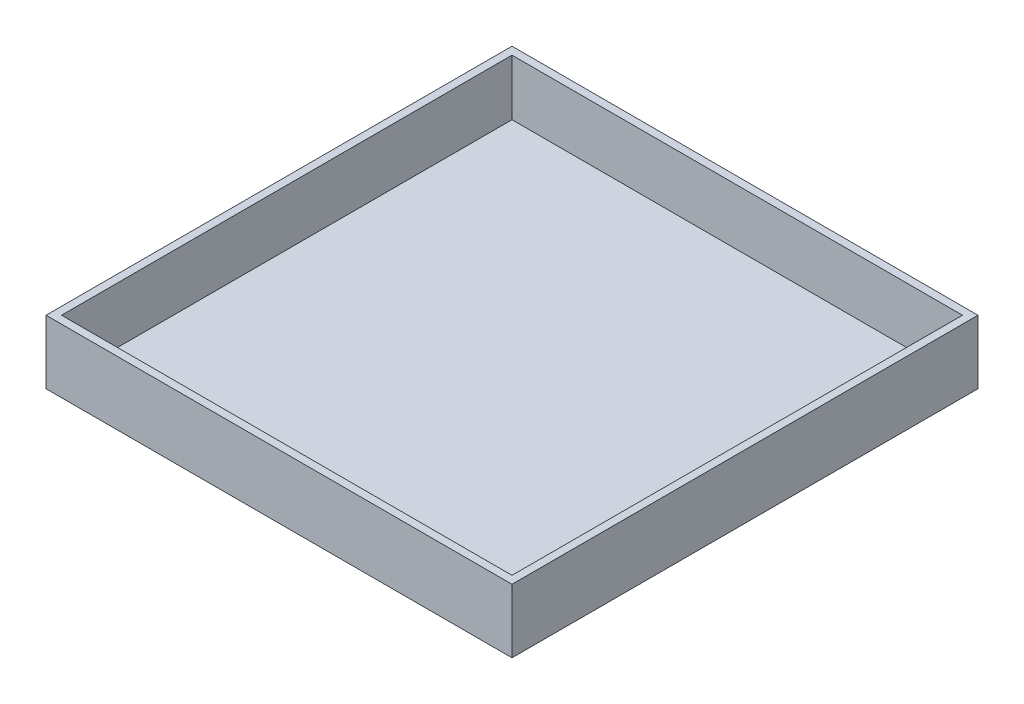
ISO-10303-21;
HEADER;
FILE_DESCRIPTION(('STEP AP214'),'2;1');
FILE_NAME('part.step','',(''),(''),'','','');
FILE_SCHEMA(('AUTOMOTIVE_DESIGN { 1 0 10303 214 1 1 1 1 }'));
ENDSEC;
DATA;
#1=APPLICATION_CONTEXT('core data for automotive mechanical design processes');
#2=APPLICATION_PROTOCOL_DEFINITION('international standard','automotive_design',2000,#1);
#3=PRODUCT_CONTEXT('',#1,'mechanical');
#4=PRODUCT('Part','Part','',(#3));
#5=PRODUCT_RELATED_PRODUCT_CATEGORY('part','',(#4));
#6=PRODUCT_DEFINITION_FORMATION('','',#4);
#7=PRODUCT_DEFINITION_CONTEXT('part definition',#1,'design');
#8=PRODUCT_DEFINITION('design','',#6,#7);
#9=PRODUCT_DEFINITION_SHAPE('','',#8);
#10=(LENGTH_UNIT() NAMED_UNIT(*) SI_UNIT(.MILLI.,.METRE.));
#11=(NAMED_UNIT(*) PLANE_ANGLE_UNIT() SI_UNIT($,.RADIAN.));
#12=(NAMED_UNIT(*) SI_UNIT($,.STERADIAN.) SOLID_ANGLE_UNIT());
#13=UNCERTAINTY_MEASURE_WITH_UNIT(LENGTH_MEASURE(1.E-05),#10,'distance_accuracy_value','');
#14=(GEOMETRIC_REPRESENTATION_CONTEXT(3) GLOBAL_UNCERTAINTY_ASSIGNED_CONTEXT((#13)) GLOBAL_UNIT_ASSIGNED_CONTEXT((#10,
#11,#12)) REPRESENTATION_CONTEXT('',''));
#15=CARTESIAN_POINT('',(0.,0.,0.));
#16=DIRECTION('',(0.,0.,1.));
#17=DIRECTION('',(1.,0.,0.));
#18=AXIS2_PLACEMENT_3D('',#15,#16,#17);
#19=CARTESIAN_POINT('',(-150.,5.,-150.));
#20=DIRECTION('',(1.,0.,0.));
#21=DIRECTION('',(0.,0.,-1.));
#22=AXIS2_PLACEMENT_3D('',#19,#20,#21);
#23=PLANE('',#22);
#24=DIRECTION('',(0.,0.,1.));
#25=VECTOR('',#24,1.);
#26=CARTESIAN_POINT('',(-150.,0.,-150.));
#27=LINE('',#26,#25);
#28=CARTESIAN_POINT('',(-150.,0.,-150.));
#29=VERTEX_POINT('',#28);
#30=CARTESIAN_POINT('',(-150.,0.,150.));
#31=VERTEX_POINT('',#30);
#32=EDGE_CURVE('E167',#29,#31,#27,.T.);
#33=ORIENTED_EDGE('',*,*,#32,.T.);
#34=DIRECTION('',(0.,-1.,0.));
#35=VECTOR('',#34,1.);
#36=CARTESIAN_POINT('',(-150.,5.,150.));
#37=LINE('',#36,#35);
#38=CARTESIAN_POINT('',(-150.,41.,150.));
#39=VERTEX_POINT('',#38);
#40=EDGE_CURVE('E11',#39,#31,#37,.T.);
#41=ORIENTED_EDGE('',*,*,#40,.F.);
#42=DIRECTION('',(0.,0.,1.));
#43=VECTOR('',#42,1.);
#44=CARTESIAN_POINT('',(-150.,41.,-150.));
#45=LINE('',#44,#43);
#46=CARTESIAN_POINT('',(-150.,41.,-150.));
#47=VERTEX_POINT('',#46);
#48=EDGE_CURVE('E120',#47,#39,#45,.T.);
#49=ORIENTED_EDGE('',*,*,#48,.F.);
#50=DIRECTION('',(0.,-1.,0.));
#51=VECTOR('',#50,1.);
#52=CARTESIAN_POINT('',(-150.,5.,-150.));
#53=LINE('',#52,#51);
#54=EDGE_CURVE('E180',#47,#29,#53,.T.);
#55=ORIENTED_EDGE('',*,*,#54,.T.);
#56=EDGE_LOOP('',(#33,#41,#49,#55));
#57=FACE_BOUND('',#56,.T.);
#58=ADVANCED_FACE('F39',(#57),#23,.F.);
#59=CARTESIAN_POINT('',(-150.,5.,150.));
#60=DIRECTION('',(0.,0.,-1.));
#61=DIRECTION('',(-1.,0.,0.));
#62=AXIS2_PLACEMENT_3D('',#59,#60,#61);
#63=PLANE('',#62);
#64=DIRECTION('',(1.,0.,0.));
#65=VECTOR('',#64,1.);
#66=CARTESIAN_POINT('',(-150.,0.,150.));
#67=LINE('',#66,#65);
#68=CARTESIAN_POINT('',(150.,0.,150.));
#69=VERTEX_POINT('',#68);
#70=EDGE_CURVE('E171',#31,#69,#67,.T.);
#71=ORIENTED_EDGE('',*,*,#70,.T.);
#72=DIRECTION('',(0.,-1.,0.));
#73=VECTOR('',#72,1.);
#74=CARTESIAN_POINT('',(150.,5.,150.));
#75=LINE('',#74,#73);
#76=CARTESIAN_POINT('',(150.,41.,150.));
#77=VERTEX_POINT('',#76);
#78=EDGE_CURVE('E47',#77,#69,#75,.T.);
#79=ORIENTED_EDGE('',*,*,#78,.F.);
#80=DIRECTION('',(1.,0.,0.));
#81=VECTOR('',#80,1.);
#82=CARTESIAN_POINT('',(-150.,41.,150.));
#83=LINE('',#82,#81);
#84=EDGE_CURVE('E155',#39,#77,#83,.T.);
#85=ORIENTED_EDGE('',*,*,#84,.F.);
#86=ORIENTED_EDGE('',*,*,#40,.T.);
#87=EDGE_LOOP('',(#71,#79,#85,#86));
#88=FACE_BOUND('',#87,.T.);
#89=ADVANCED_FACE('F205',(#88),#63,.F.);
#90=CARTESIAN_POINT('',(150.,5.,-150.));
#91=DIRECTION('',(-1.,0.,0.));
#92=DIRECTION('',(0.,0.,1.));
#93=AXIS2_PLACEMENT_3D('',#90,#91,#92);
#94=PLANE('',#93);
#95=DIRECTION('',(0.,0.,-1.));
#96=VECTOR('',#95,1.);
#97=CARTESIAN_POINT('',(150.,0.,-150.));
#98=LINE('',#97,#96);
#99=CARTESIAN_POINT('',(150.,0.,-150.));
#100=VERTEX_POINT('',#99);
#101=EDGE_CURVE('E174',#69,#100,#98,.T.);
#102=ORIENTED_EDGE('',*,*,#101,.T.);
#103=DIRECTION('',(0.,-1.,0.));
#104=VECTOR('',#103,1.);
#105=CARTESIAN_POINT('',(150.,5.,-150.));
#106=LINE('',#105,#104);
#107=CARTESIAN_POINT('',(150.,41.,-150.));
#108=VERTEX_POINT('',#107);
#109=EDGE_CURVE('E184',#108,#100,#106,.T.);
#110=ORIENTED_EDGE('',*,*,#109,.F.);
#111=DIRECTION('',(0.,0.,-1.));
#112=VECTOR('',#111,1.);
#113=CARTESIAN_POINT('',(150.,41.,-150.));
#114=LINE('',#113,#112);
#115=EDGE_CURVE('E159',#77,#108,#114,.T.);
#116=ORIENTED_EDGE('',*,*,#115,.F.);
#117=ORIENTED_EDGE('',*,*,#78,.T.);
#118=EDGE_LOOP('',(#102,#110,#116,#117));
#119=FACE_BOUND('',#118,.T.);
#120=ADVANCED_FACE('F192',(#119),#94,.F.);
#121=CARTESIAN_POINT('',(-150.,5.,-150.));
#122=DIRECTION('',(0.,0.,1.));
#123=DIRECTION('',(1.,0.,0.));
#124=AXIS2_PLACEMENT_3D('',#121,#122,#123);
#125=PLANE('',#124);
#126=DIRECTION('',(-1.,0.,0.));
#127=VECTOR('',#126,1.);
#128=CARTESIAN_POINT('',(-150.,0.,-150.));
#129=LINE('',#128,#127);
#130=EDGE_CURVE('E177',#100,#29,#129,.T.);
#131=ORIENTED_EDGE('',*,*,#130,.T.);
#132=ORIENTED_EDGE('',*,*,#54,.F.);
#133=DIRECTION('',(-1.,0.,0.));
#134=VECTOR('',#133,1.);
#135=CARTESIAN_POINT('',(-150.,41.,-150.));
#136=LINE('',#135,#134);
#137=EDGE_CURVE('E163',#108,#47,#136,.T.);
#138=ORIENTED_EDGE('',*,*,#137,.F.);
#139=ORIENTED_EDGE('',*,*,#109,.T.);
#140=EDGE_LOOP('',(#131,#132,#138,#139));
#141=FACE_BOUND('',#140,.T.);
#142=ADVANCED_FACE('F200',(#141),#125,.F.);
#143=CARTESIAN_POINT('',(0.,0.,0.));
#144=DIRECTION('',(0.,1.,0.));
#145=DIRECTION('',(0.,0.,1.));
#146=AXIS2_PLACEMENT_3D('',#143,#144,#145);
#147=PLANE('',#146);
#148=ORIENTED_EDGE('',*,*,#32,.F.);
#149=ORIENTED_EDGE('',*,*,#130,.F.);
#150=ORIENTED_EDGE('',*,*,#101,.F.);
#151=ORIENTED_EDGE('',*,*,#70,.F.);
#152=EDGE_LOOP('',(#148,#149,#150,#151));
#153=FACE_BOUND('',#152,.T.);
#154=ADVANCED_FACE('F198',(#153),#147,.F.);
#155=CARTESIAN_POINT('',(0.,41.,0.));
#156=DIRECTION('',(0.,1.,0.));
#157=DIRECTION('',(0.,0.,1.));
#158=AXIS2_PLACEMENT_3D('',#155,#156,#157);
#159=PLANE('',#158);
#160=ORIENTED_EDGE('',*,*,#48,.T.);
#161=ORIENTED_EDGE('',*,*,#84,.T.);
#162=ORIENTED_EDGE('',*,*,#115,.T.);
#163=ORIENTED_EDGE('',*,*,#137,.T.);
#164=EDGE_LOOP('',(#160,#161,#162,#163));
#165=FACE_BOUND('',#164,.T.);
#166=DIRECTION('',(1.,0.,0.));
#167=VECTOR('',#166,1.);
#168=CARTESIAN_POINT('',(-145.,41.,145.));
#169=LINE('',#168,#167);
#170=CARTESIAN_POINT('',(-145.,41.,145.));
#171=VERTEX_POINT('',#170);
#172=CARTESIAN_POINT('',(145.,41.,145.));
#173=VERTEX_POINT('',#172);
#174=EDGE_CURVE('E113',#171,#173,#169,.T.);
#175=ORIENTED_EDGE('',*,*,#174,.F.);
#176=DIRECTION('',(0.,0.,1.));
#177=VECTOR('',#176,1.);
#178=CARTESIAN_POINT('',(-145.,41.,-145.));
#179=LINE('',#178,#177);
#180=CARTESIAN_POINT('',(-145.,41.,-145.));
#181=VERTEX_POINT('',#180);
#182=EDGE_CURVE('E103',#181,#171,#179,.T.);
#183=ORIENTED_EDGE('',*,*,#182,.F.);
#184=DIRECTION('',(-1.,0.,0.));
#185=VECTOR('',#184,1.);
#186=CARTESIAN_POINT('',(-145.,41.,-145.));
#187=LINE('',#186,#185);
#188=CARTESIAN_POINT('',(145.,41.,-145.));
#189=VERTEX_POINT('',#188);
#190=EDGE_CURVE('E130',#189,#181,#187,.T.);
#191=ORIENTED_EDGE('',*,*,#190,.F.);
#192=DIRECTION('',(0.,0.,-1.));
#193=VECTOR('',#192,1.);
#194=CARTESIAN_POINT('',(145.,41.,-145.));
#195=LINE('',#194,#193);
#196=EDGE_CURVE('E126',#173,#189,#195,.T.);
#197=ORIENTED_EDGE('',*,*,#196,.F.);
#198=EDGE_LOOP('',(#175,#183,#191,#197));
#199=FACE_BOUND('',#198,.T.);
#200=ADVANCED_FACE('F124',(#165,#199),#159,.T.);
#201=CARTESIAN_POINT('',(-145.,41.,-145.));
#202=DIRECTION('',(1.,0.,0.));
#203=DIRECTION('',(0.,0.,-1.));
#204=AXIS2_PLACEMENT_3D('',#201,#202,#203);
#205=PLANE('',#204);
#206=DIRECTION('',(0.,0.,1.));
#207=VECTOR('',#206,1.);
#208=CARTESIAN_POINT('',(-145.,5.,-145.));
#209=LINE('',#208,#207);
#210=CARTESIAN_POINT('',(-145.,5.,-145.));
#211=VERTEX_POINT('',#210);
#212=CARTESIAN_POINT('',(-145.,5.,145.));
#213=VERTEX_POINT('',#212);
#214=EDGE_CURVE('E54',#211,#213,#209,.T.);
#215=ORIENTED_EDGE('',*,*,#214,.F.);
#216=DIRECTION('',(0.,-1.,0.));
#217=VECTOR('',#216,1.);
#218=CARTESIAN_POINT('',(-145.,41.,-145.));
#219=LINE('',#218,#217);
#220=EDGE_CURVE('E108',#181,#211,#219,.T.);
#221=ORIENTED_EDGE('',*,*,#220,.F.);
#222=ORIENTED_EDGE('',*,*,#182,.T.);
#223=DIRECTION('',(0.,-1.,0.));
#224=VECTOR('',#223,1.);
#225=CARTESIAN_POINT('',(-145.,41.,145.));
#226=LINE('',#225,#224);
#227=EDGE_CURVE('E106',#171,#213,#226,.T.);
#228=ORIENTED_EDGE('',*,*,#227,.T.);
#229=EDGE_LOOP('',(#215,#221,#222,#228));
#230=FACE_BOUND('',#229,.T.);
#231=ADVANCED_FACE('F105',(#230),#205,.T.);
#232=CARTESIAN_POINT('',(-145.,41.,145.));
#233=DIRECTION('',(0.,0.,-1.));
#234=DIRECTION('',(-1.,0.,0.));
#235=AXIS2_PLACEMENT_3D('',#232,#233,#234);
#236=PLANE('',#235);
#237=DIRECTION('',(1.,0.,0.));
#238=VECTOR('',#237,1.);
#239=CARTESIAN_POINT('',(-145.,5.,145.));
#240=LINE('',#239,#238);
#241=CARTESIAN_POINT('',(145.,5.,145.));
#242=VERTEX_POINT('',#241);
#243=EDGE_CURVE('E58',#213,#242,#240,.T.);
#244=ORIENTED_EDGE('',*,*,#243,.F.);
#245=ORIENTED_EDGE('',*,*,#227,.F.);
#246=ORIENTED_EDGE('',*,*,#174,.T.);
#247=DIRECTION('',(0.,-1.,0.));
#248=VECTOR('',#247,1.);
#249=CARTESIAN_POINT('',(145.,41.,145.));
#250=LINE('',#249,#248);
#251=EDGE_CURVE('E121',#173,#242,#250,.T.);
#252=ORIENTED_EDGE('',*,*,#251,.T.);
#253=EDGE_LOOP('',(#244,#245,#246,#252));
#254=FACE_BOUND('',#253,.T.);
#255=ADVANCED_FACE('F117',(#254),#236,.T.);
#256=CARTESIAN_POINT('',(145.,41.,-145.));
#257=DIRECTION('',(-1.,0.,0.));
#258=DIRECTION('',(0.,0.,1.));
#259=AXIS2_PLACEMENT_3D('',#256,#257,#258);
#260=PLANE('',#259);
#261=DIRECTION('',(0.,0.,-1.));
#262=VECTOR('',#261,1.);
#263=CARTESIAN_POINT('',(145.,5.,-145.));
#264=LINE('',#263,#262);
#265=CARTESIAN_POINT('',(145.,5.,-145.));
#266=VERTEX_POINT('',#265);
#267=EDGE_CURVE('E139',#242,#266,#264,.T.);
#268=ORIENTED_EDGE('',*,*,#267,.F.);
#269=ORIENTED_EDGE('',*,*,#251,.F.);
#270=ORIENTED_EDGE('',*,*,#196,.T.);
#271=DIRECTION('',(0.,-1.,0.));
#272=VECTOR('',#271,1.);
#273=CARTESIAN_POINT('',(145.,41.,-145.));
#274=LINE('',#273,#272);
#275=EDGE_CURVE('E146',#189,#266,#274,.T.);
#276=ORIENTED_EDGE('',*,*,#275,.T.);
#277=EDGE_LOOP('',(#268,#269,#270,#276));
#278=FACE_BOUND('',#277,.T.);
#279=ADVANCED_FACE('F227',(#278),#260,.T.);
#280=CARTESIAN_POINT('',(-145.,41.,-145.));
#281=DIRECTION('',(0.,0.,1.));
#282=DIRECTION('',(1.,0.,0.));
#283=AXIS2_PLACEMENT_3D('',#280,#281,#282);
#284=PLANE('',#283);
#285=DIRECTION('',(-1.,0.,0.));
#286=VECTOR('',#285,1.);
#287=CARTESIAN_POINT('',(-145.,5.,-145.));
#288=LINE('',#287,#286);
#289=EDGE_CURVE('E114',#266,#211,#288,.T.);
#290=ORIENTED_EDGE('',*,*,#289,.F.);
#291=ORIENTED_EDGE('',*,*,#275,.F.);
#292=ORIENTED_EDGE('',*,*,#190,.T.);
#293=ORIENTED_EDGE('',*,*,#220,.T.);
#294=EDGE_LOOP('',(#290,#291,#292,#293));
#295=FACE_BOUND('',#294,.T.);
#296=ADVANCED_FACE('F220',(#295),#284,.T.);
#297=CARTESIAN_POINT('',(0.,5.,0.));
#298=DIRECTION('',(0.,1.,0.));
#299=DIRECTION('',(0.,0.,1.));
#300=AXIS2_PLACEMENT_3D('',#297,#298,#299);
#301=PLANE('',#300);
#302=ORIENTED_EDGE('',*,*,#214,.T.);
#303=ORIENTED_EDGE('',*,*,#243,.T.);
#304=ORIENTED_EDGE('',*,*,#267,.T.);
#305=ORIENTED_EDGE('',*,*,#289,.T.);
#306=EDGE_LOOP('',(#302,#303,#304,#305));
#307=FACE_BOUND('',#306,.T.);
#308=ADVANCED_FACE('F217',(#307),#301,.T.);
#309=CLOSED_SHELL('',(#58,#89,#120,#142,#154,#200,#231,#255,#279,#296,#308));
#310=MANIFOLD_SOLID_BREP('B2',#309);
#311=ADVANCED_BREP_SHAPE_REPRESENTATION('',(#18,#310),#14);
#312=SHAPE_DEFINITION_REPRESENTATION(#9,#311);
ENDSEC;
END-ISO-10303-21;
